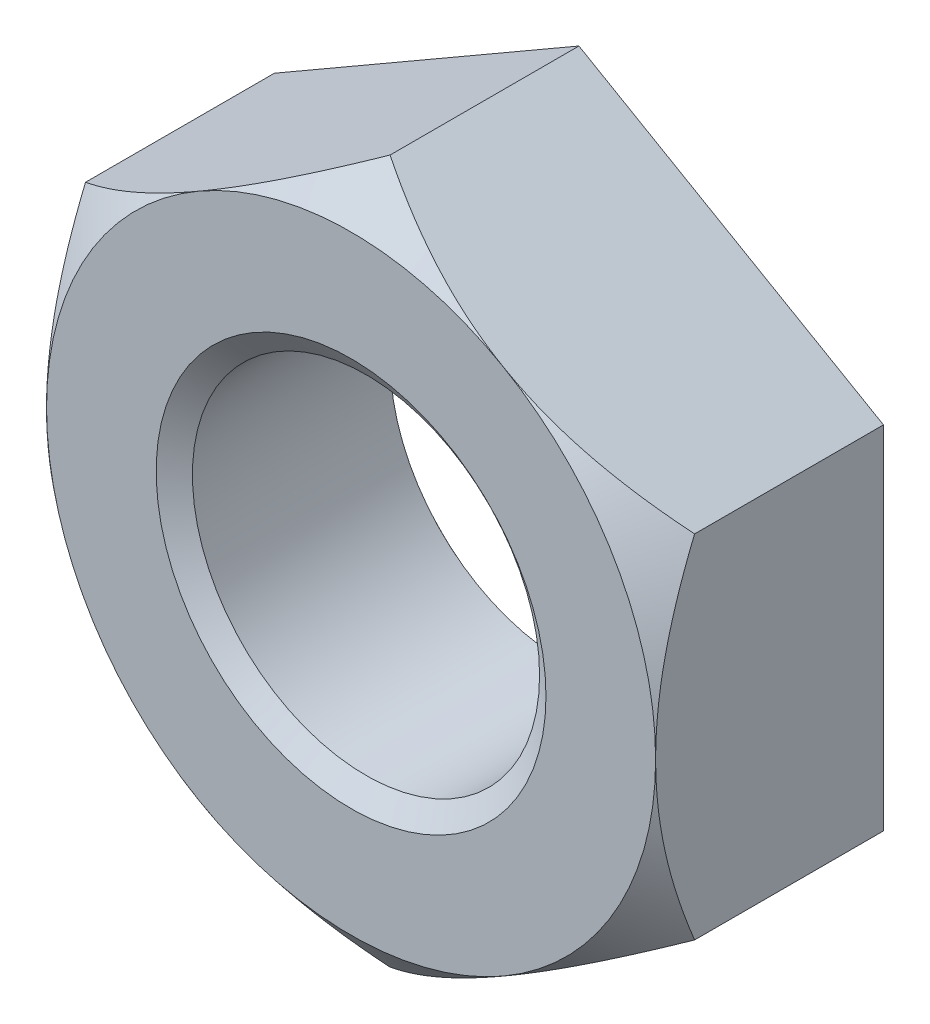
ISO-10303-21;
HEADER;
FILE_DESCRIPTION(('STEP AP214'),'2;1');
FILE_NAME('part.step','',(''),(''),'','','');
FILE_SCHEMA(('AUTOMOTIVE_DESIGN { 1 0 10303 214 1 1 1 1 }'));
ENDSEC;
DATA;
#1=APPLICATION_CONTEXT('core data for automotive mechanical design processes');
#2=APPLICATION_PROTOCOL_DEFINITION('international standard','automotive_design',2000,#1);
#3=PRODUCT_CONTEXT('',#1,'mechanical');
#4=PRODUCT('Part','Part','',(#3));
#5=PRODUCT_RELATED_PRODUCT_CATEGORY('part','',(#4));
#6=PRODUCT_DEFINITION_FORMATION('','',#4);
#7=PRODUCT_DEFINITION_CONTEXT('part definition',#1,'design');
#8=PRODUCT_DEFINITION('design','',#6,#7);
#9=PRODUCT_DEFINITION_SHAPE('','',#8);
#10=(LENGTH_UNIT() NAMED_UNIT(*) SI_UNIT(.MILLI.,.METRE.));
#11=(NAMED_UNIT(*) PLANE_ANGLE_UNIT() SI_UNIT($,.RADIAN.));
#12=(NAMED_UNIT(*) SI_UNIT($,.STERADIAN.) SOLID_ANGLE_UNIT());
#13=UNCERTAINTY_MEASURE_WITH_UNIT(LENGTH_MEASURE(1.E-05),#10,'distance_accuracy_value','');
#14=(GEOMETRIC_REPRESENTATION_CONTEXT(3) GLOBAL_UNCERTAINTY_ASSIGNED_CONTEXT((#13)) GLOBAL_UNIT_ASSIGNED_CONTEXT((#10,
#11,#12)) REPRESENTATION_CONTEXT('',''));
#15=CARTESIAN_POINT('',(0.,0.,0.));
#16=DIRECTION('',(0.,0.,1.));
#17=DIRECTION('',(1.,0.,0.));
#18=AXIS2_PLACEMENT_3D('',#15,#16,#17);
#19=CARTESIAN_POINT('',(0.,0.,-29.6926));
#20=DIRECTION('',(0.,0.,1.));
#21=DIRECTION('',(1.,0.,0.));
#22=AXIS2_PLACEMENT_3D('',#19,#20,#21);
#23=CYLINDRICAL_SURFACE('',#22,22.62124);
#24=CARTESIAN_POINT('',(0.,0.,-1.9457086988756));
#25=DIRECTION('',(0.,0.,1.));
#26=DIRECTION('',(1.,0.,0.));
#27=AXIS2_PLACEMENT_3D('',#24,#25,#26);
#28=CIRCLE('',#27,22.62124);
#29=CARTESIAN_POINT('',(22.62124,0.,-1.9457086988756));
#30=VERTEX_POINT('',#29);
#31=EDGE_CURVE('E130',#30,#30,#28,.F.);
#32=ORIENTED_EDGE('',*,*,#31,.F.);
#33=EDGE_LOOP('',(#32));
#34=FACE_BOUND('',#33,.T.);
#35=CARTESIAN_POINT('',(0.,0.,-27.7214913011244));
#36=DIRECTION('',(0.,0.,-1.));
#37=DIRECTION('',(-1.,0.,0.));
#38=AXIS2_PLACEMENT_3D('',#35,#36,#37);
#39=CIRCLE('',#38,22.62124);
#40=CARTESIAN_POINT('',(-22.62124,0.,-27.7214913011244));
#41=VERTEX_POINT('',#40);
#42=EDGE_CURVE('E37',#41,#41,#39,.F.);
#43=ORIENTED_EDGE('',*,*,#42,.F.);
#44=EDGE_LOOP('',(#43));
#45=FACE_BOUND('',#44,.T.);
#46=ADVANCED_FACE('F32',(#34,#45),#23,.F.);
#47=CARTESIAN_POINT('',(-79.3749999999999,0.,0.));
#48=DIRECTION('',(0.,0.,1.));
#49=DIRECTION('',(1.,0.,0.));
#50=AXIS2_PLACEMENT_3D('',#47,#48,#49);
#51=PLANE('',#50);
#52=CARTESIAN_POINT('',(0.,0.,0.));
#53=DIRECTION('',(0.,0.,1.));
#54=DIRECTION('',(1.,0.,0.));
#55=AXIS2_PLACEMENT_3D('',#52,#53,#54);
#56=CIRCLE('',#55,25.4);
#57=CARTESIAN_POINT('',(25.4,0.,0.));
#58=VERTEX_POINT('',#57);
#59=EDGE_CURVE('E217',#58,#58,#56,.T.);
#60=ORIENTED_EDGE('',*,*,#59,.F.);
#61=EDGE_LOOP('',(#60));
#62=FACE_BOUND('',#61,.T.);
#63=CARTESIAN_POINT('',(0.,0.,0.));
#64=DIRECTION('',(0.,0.,1.));
#65=DIRECTION('',(1.,0.,0.));
#66=AXIS2_PLACEMENT_3D('',#63,#64,#65);
#67=CIRCLE('',#66,39.6875);
#68=CARTESIAN_POINT('',(39.6875,0.,0.));
#69=VERTEX_POINT('',#68);
#70=CARTESIAN_POINT('',(19.84375,-34.3703832126949,0.));
#71=VERTEX_POINT('',#70);
#72=EDGE_CURVE('E11',#69,#71,#67,.F.);
#73=ORIENTED_EDGE('',*,*,#72,.F.);
#74=CARTESIAN_POINT('',(0.,0.,0.));
#75=DIRECTION('',(0.,0.,1.));
#76=DIRECTION('',(1.,0.,0.));
#77=AXIS2_PLACEMENT_3D('',#74,#75,#76);
#78=CIRCLE('',#77,39.6875);
#79=CARTESIAN_POINT('',(19.8437500000001,34.3703832126949,0.));
#80=VERTEX_POINT('',#79);
#81=EDGE_CURVE('E122',#69,#80,#78,.T.);
#82=ORIENTED_EDGE('',*,*,#81,.T.);
#83=CARTESIAN_POINT('',(-19.84375,34.3703832126949,0.));
#84=VERTEX_POINT('',#83);
#85=EDGE_CURVE('E44',#84,#80,#67,.F.);
#86=ORIENTED_EDGE('',*,*,#85,.F.);
#87=CARTESIAN_POINT('',(-39.6875,0.,0.));
#88=VERTEX_POINT('',#87);
#89=EDGE_CURVE('E271',#88,#84,#67,.F.);
#90=ORIENTED_EDGE('',*,*,#89,.F.);
#91=CARTESIAN_POINT('',(-19.84375,-34.3703832126949,0.));
#92=VERTEX_POINT('',#91);
#93=EDGE_CURVE('E273',#92,#88,#67,.F.);
#94=ORIENTED_EDGE('',*,*,#93,.F.);
#95=EDGE_CURVE('E42',#71,#92,#67,.F.);
#96=ORIENTED_EDGE('',*,*,#95,.F.);
#97=EDGE_LOOP('',(#73,#82,#86,#90,#94,#96));
#98=FACE_BOUND('',#97,.T.);
#99=ADVANCED_FACE('F132',(#62,#98),#51,.T.);
#100=CARTESIAN_POINT('',(0.,45.8271776169266,-29.6926));
#101=DIRECTION('',(-0.500000000000001,0.866025403784438,0.));
#102=DIRECTION('',(-0.866025403784438,-0.500000000000001,0.));
#103=AXIS2_PLACEMENT_3D('',#100,#101,#102);
#104=PLANE('',#103);
#105=CARTESIAN_POINT('',(0.000200000000008648,45.8272930869804,-5.08009554086177));
#106=CARTESIAN_POINT('',(-0.675362378218132,45.4372569660618,-4.75740980637057));
#107=CARTESIAN_POINT('',(-1.3547569213277,45.0450083437115,-4.44518483659009));
#108=CARTESIAN_POINT('',(-2.72161040098432,44.255855119289,-3.8444644403435));
#109=CARTESIAN_POINT('',(-3.40907190062726,43.8589490374126,-3.55597680269755));
#110=CARTESIAN_POINT('',(-4.79420473338667,43.0592422235556,-3.00488379402706));
#111=CARTESIAN_POINT('',(-5.49190147905994,42.6564268196284,-2.74236315877935));
#112=CARTESIAN_POINT('',(-6.89523688741963,41.8462107438486,-2.24748448913265));
#113=CARTESIAN_POINT('',(-7.60087484104338,41.4388104813735,-2.0151237846422));
#114=CARTESIAN_POINT('',(-9.01334120141884,40.6233226479894,-1.58581833885084));
#115=CARTESIAN_POINT('',(-9.72010005572324,40.2152752332046,-1.38856992044724));
#116=CARTESIAN_POINT('',(-11.1404844329942,39.3952159306345,-1.03010323704616));
#117=CARTESIAN_POINT('',(-11.8541100481971,38.9832039895965,-0.868885456729332));
#118=CARTESIAN_POINT('',(-13.2863448470649,38.1563028429274,-0.585602272074939));
#119=CARTESIAN_POINT('',(-14.0049472620728,37.7414175451823,-0.463491507583696));
#120=CARTESIAN_POINT('',(-15.446538218661,36.9091146183348,-0.260639689408306));
#121=CARTESIAN_POINT('',(-16.1695267221796,36.4916970112073,-0.179898277247445));
#122=CARTESIAN_POINT('',(-17.630331069793,35.6483012278793,-0.0605545378182199));
#123=CARTESIAN_POINT('',(-18.368192043889,35.2222969958605,-0.0226825232988908));
#124=CARTESIAN_POINT('',(-19.8446204307072,34.3698806692918,0.00757152347880483));
#125=CARTESIAN_POINT('',(-20.5831878468339,33.9434685727764,-4.66645945184485E-05));
#126=CARTESIAN_POINT('',(-22.059242806536,33.0912678444537,-0.0606042335508548));
#127=CARTESIAN_POINT('',(-22.7967297343713,32.6654795681441,-0.113563491625037));
#128=CARTESIAN_POINT('',(-24.2683079349113,31.8158634979287,-0.263592304194731));
#129=CARTESIAN_POINT('',(-25.0023992066788,31.3920357045641,-0.360661870865582));
#130=CARTESIAN_POINT('',(-26.465573084514,30.5472718723246,-0.596784274101464));
#131=CARTESIAN_POINT('',(-27.194654967739,30.1263362507834,-0.735843044678707));
#132=CARTESIAN_POINT('',(-28.6463836691976,29.288180294206,-1.05312836783003));
#133=CARTESIAN_POINT('',(-29.3690302955407,28.8709600699578,-1.23135608432558));
#134=CARTESIAN_POINT('',(-30.8067522929465,28.0408908877358,-1.62370548470428));
#135=CARTESIAN_POINT('',(-31.5218294409757,27.6280409038298,-1.83781853634994));
#136=CARTESIAN_POINT('',(-32.944072074641,26.8069087364301,-2.2985964240863));
#137=CARTESIAN_POINT('',(-33.6512373169414,26.3986266934264,-2.54526225838923));
#138=CARTESIAN_POINT('',(-34.8062681966621,25.7317693040973,-2.97446619349774));
#139=CARTESIAN_POINT('',(-35.2565422540784,25.471803455839,-3.14844506359477));
#140=CARTESIAN_POINT('',(-36.1535852489752,24.9538954412606,-3.50755980192611));
#141=CARTESIAN_POINT('',(-36.6003552410455,24.695952666073,-3.69269215538246));
#142=CARTESIAN_POINT('',(-37.4890449541568,24.1828674209821,-4.07269340288885));
#143=CARTESIAN_POINT('',(-37.9309759964886,23.9277184147286,-4.26752708270077));
#144=CARTESIAN_POINT('',(-38.811702131736,23.4192309434612,-4.66680287394708));
#145=CARTESIAN_POINT('',(-39.2504964008522,23.1658929540681,-4.87124740983446));
#146=CARTESIAN_POINT('',(-39.6877,22.9134733384094,-5.08009554086174));
#147=B_SPLINE_CURVE_WITH_KNOTS('',3,(#105,#106,#107,#108,#109,#110,#111,#112,#113,#114,#115,
#116,#117,#118,#119,#120,#121,#122,#123,#124,#125,#126,#127,#128,#129,#130,#131,#132,#133,#134,
#135,#136,#137,#138,#139,#140,#141,#142,#143,#144,#145,#146),.UNSPECIFIED.,.F.,.F.,(4,2,2,2,2,2,
2,2,2,2,2,2,2,2,2,2,2,2,2,2,4),(0.,2.53259620096936,5.06602012425204,7.60745580196207,
10.1486663299222,12.6667002043744,15.1847679491354,17.6999043239812,20.2150189041161,
22.7723642868658,25.329722056122,27.888201526601,30.4466817032726,33.0055236196886,
35.5644415834371,38.1227448791952,40.6811266420771,42.3258117324123,43.9699812198112,
45.608565036544,47.2475644472487),.UNSPECIFIED.);
#148=CARTESIAN_POINT('',(0.,45.8271776169266,-5.08));
#149=VERTEX_POINT('',#148);
#150=EDGE_CURVE('E182',#149,#84,#147,.T.);
#151=ORIENTED_EDGE('',*,*,#150,.F.);
#152=DIRECTION('',(0.,0.,1.));
#153=VECTOR('',#152,1.);
#154=CARTESIAN_POINT('',(0.,45.8271776169266,-29.6926));
#155=LINE('',#154,#153);
#156=CARTESIAN_POINT('',(0.,45.8271776169266,-29.6926));
#157=VERTEX_POINT('',#156);
#158=EDGE_CURVE('E241',#157,#149,#155,.T.);
#159=ORIENTED_EDGE('',*,*,#158,.F.);
#160=DIRECTION('',(-0.866025403784438,-0.500000000000001,0.));
#161=VECTOR('',#160,1.);
#162=CARTESIAN_POINT('',(0.,45.8271776169266,-29.6926));
#163=LINE('',#162,#161);
#164=CARTESIAN_POINT('',(-39.6875,22.9135888084633,-29.6926));
#165=VERTEX_POINT('',#164);
#166=EDGE_CURVE('E138',#157,#165,#163,.T.);
#167=ORIENTED_EDGE('',*,*,#166,.T.);
#168=DIRECTION('',(0.,0.,1.));
#169=VECTOR('',#168,1.);
#170=CARTESIAN_POINT('',(-39.6875,22.9135888084633,-29.6926));
#171=LINE('',#170,#169);
#172=CARTESIAN_POINT('',(-39.6875,22.9135888084633,-5.08));
#173=VERTEX_POINT('',#172);
#174=EDGE_CURVE('E228',#165,#173,#171,.T.);
#175=ORIENTED_EDGE('',*,*,#174,.T.);
#176=EDGE_CURVE('E177',#84,#173,#147,.T.);
#177=ORIENTED_EDGE('',*,*,#176,.F.);
#178=EDGE_LOOP('',(#151,#159,#167,#175,#177));
#179=FACE_BOUND('',#178,.T.);
#180=ADVANCED_FACE('F34',(#179),#104,.T.);
#181=CARTESIAN_POINT('',(39.6875,22.9135888084632,-29.6926));
#182=DIRECTION('',(0.500000000000001,0.866025403784438,0.));
#183=DIRECTION('',(-0.866025403784438,0.500000000000001,0.));
#184=AXIS2_PLACEMENT_3D('',#181,#182,#183);
#185=PLANE('',#184);
#186=CARTESIAN_POINT('',(39.6877,22.9134733384094,-5.08009554086173));
#187=CARTESIAN_POINT('',(39.0121376217819,23.303509459328,-4.75740980637053));
#188=CARTESIAN_POINT('',(38.3327430786723,23.6957580816783,-4.44518483659006));
#189=CARTESIAN_POINT('',(36.9658895990157,24.4849113061008,-3.84446444034347));
#190=CARTESIAN_POINT('',(36.2784280993727,24.8818173879772,-3.55597680269752));
#191=CARTESIAN_POINT('',(34.8932952666133,25.6815242018342,-3.00488379402703));
#192=CARTESIAN_POINT('',(34.1955985209401,26.0843396057614,-2.74236315877932));
#193=CARTESIAN_POINT('',(32.7922631125804,26.8945556815412,-2.24748448913262));
#194=CARTESIAN_POINT('',(32.0866251589566,27.3019559440163,-2.01512378464218));
#195=CARTESIAN_POINT('',(30.6741587985812,28.1174437774003,-1.58581833885082));
#196=CARTESIAN_POINT('',(29.9673999442768,28.5254911921851,-1.38856992044722));
#197=CARTESIAN_POINT('',(28.5470155670058,29.3455504947553,-1.03010323704614));
#198=CARTESIAN_POINT('',(27.8333899518029,29.7575624357933,-0.868885456729312));
#199=CARTESIAN_POINT('',(26.4011551529351,30.5844635824624,-0.585602272074926));
#200=CARTESIAN_POINT('',(25.6825527379272,30.9993488802075,-0.463491507583685));
#201=CARTESIAN_POINT('',(24.240961781339,31.831651807055,-0.260639689408294));
#202=CARTESIAN_POINT('',(23.5179732778204,32.2490694141825,-0.179898277247429));
#203=CARTESIAN_POINT('',(22.057168930207,33.0924651975105,-0.0605545378182037));
#204=CARTESIAN_POINT('',(21.3193079561111,33.5184694295293,-0.0226825232988784));
#205=CARTESIAN_POINT('',(19.8428795692928,34.370885756098,0.00757152347881256));
#206=CARTESIAN_POINT('',(19.1043121531661,34.7972978526134,-4.66645945114453E-05));
#207=CARTESIAN_POINT('',(17.628257193464,35.6494985809361,-0.0606042335508486));
#208=CARTESIAN_POINT('',(16.8907702656287,36.0752868572457,-0.11356349162503));
#209=CARTESIAN_POINT('',(15.4191920650887,36.924902927461,-0.263592304194725));
#210=CARTESIAN_POINT('',(14.6851007933213,37.3487307208257,-0.360661870865576));
#211=CARTESIAN_POINT('',(13.221926915486,38.1934945530651,-0.59678427410146));
#212=CARTESIAN_POINT('',(12.492845032261,38.6144301746064,-0.735843044678707));
#213=CARTESIAN_POINT('',(11.0411163308025,39.4525861311838,-1.05312836783003));
#214=CARTESIAN_POINT('',(10.3184697044593,39.869806355432,-1.23135608432558));
#215=CARTESIAN_POINT('',(8.88074770705355,40.699875537654,-1.62370548470428));
#216=CARTESIAN_POINT('',(8.16567055902437,41.11272552156,-1.83781853634993));
#217=CARTESIAN_POINT('',(6.74342792535908,41.9338576889596,-2.2985964240863));
#218=CARTESIAN_POINT('',(6.03626268305861,42.3421397319634,-2.54526225838923));
#219=CARTESIAN_POINT('',(4.8812318033379,43.0089971212925,-2.97446619349775));
#220=CARTESIAN_POINT('',(4.43095774592168,43.2689629695508,-3.14844506359478));
#221=CARTESIAN_POINT('',(3.53391475102487,43.7868709841292,-3.50755980192612));
#222=CARTESIAN_POINT('',(3.08714475895457,44.0448137593168,-3.69269215538248));
#223=CARTESIAN_POINT('',(2.19845504584327,44.5578990044077,-4.07269340288887));
#224=CARTESIAN_POINT('',(1.75652400351137,44.8130480106612,-4.26752708270078));
#225=CARTESIAN_POINT('',(0.875797868263965,45.3215354819287,-4.6668028739471));
#226=CARTESIAN_POINT('',(0.437003599147832,45.5748734713217,-4.87124740983448));
#227=CARTESIAN_POINT('',(-0.000199999999992159,45.8272930869804,-5.08009554086177));
#228=B_SPLINE_CURVE_WITH_KNOTS('',3,(#186,#187,#188,#189,#190,#191,#192,#193,#194,#195,#196,
#197,#198,#199,#200,#201,#202,#203,#204,#205,#206,#207,#208,#209,#210,#211,#212,#213,#214,#215,
#216,#217,#218,#219,#220,#221,#222,#223,#224,#225,#226,#227),.UNSPECIFIED.,.F.,.F.,(4,2,2,2,2,2,
2,2,2,2,2,2,2,2,2,2,2,2,2,2,4),(0.,2.53259620096935,5.06602012425204,7.60745580196207,
10.1486663299222,12.6667002043744,15.1847679491354,17.6999043239812,20.2150189041161,
22.7723642868658,25.329722056122,27.888201526601,30.4466817032726,33.0055236196886,
35.5644415834371,38.1227448791951,40.681126642077,42.3258117324123,43.9699812198112,
45.608565036544,47.2475644472487),.UNSPECIFIED.);
#229=CARTESIAN_POINT('',(39.6875,22.9135888084633,-5.08));
#230=VERTEX_POINT('',#229);
#231=EDGE_CURVE('E125',#230,#80,#228,.T.);
#232=ORIENTED_EDGE('',*,*,#231,.F.);
#233=DIRECTION('',(0.,0.,1.));
#234=VECTOR('',#233,1.);
#235=CARTESIAN_POINT('',(39.6875,22.9135888084632,-29.6926));
#236=LINE('',#235,#234);
#237=CARTESIAN_POINT('',(39.6875,22.9135888084632,-29.6926));
#238=VERTEX_POINT('',#237);
#239=EDGE_CURVE('E137',#238,#230,#236,.T.);
#240=ORIENTED_EDGE('',*,*,#239,.F.);
#241=DIRECTION('',(-0.866025403784438,0.500000000000001,0.));
#242=VECTOR('',#241,1.);
#243=CARTESIAN_POINT('',(39.6875,22.9135888084632,-29.6926));
#244=LINE('',#243,#242);
#245=EDGE_CURVE('E232',#238,#157,#244,.T.);
#246=ORIENTED_EDGE('',*,*,#245,.T.);
#247=ORIENTED_EDGE('',*,*,#158,.T.);
#248=EDGE_CURVE('E148',#80,#149,#228,.T.);
#249=ORIENTED_EDGE('',*,*,#248,.F.);
#250=EDGE_LOOP('',(#232,#240,#246,#247,#249));
#251=FACE_BOUND('',#250,.T.);
#252=ADVANCED_FACE('F163',(#251),#185,.T.);
#253=CARTESIAN_POINT('',(39.6875,22.9135888084632,-29.6926));
#254=DIRECTION('',(-1.,0.,0.));
#255=DIRECTION('',(0.,-1.,0.));
#256=AXIS2_PLACEMENT_3D('',#253,#254,#255);
#257=PLANE('',#256);
#258=ORIENTED_EDGE('',*,*,#239,.T.);
#259=CARTESIAN_POINT('',(39.6875,-51.6328225617732,-21.0457198261144));
#260=CARTESIAN_POINT('',(39.6875,-50.9711763672413,-20.6116874485865));
#261=CARTESIAN_POINT('',(39.6875,-50.3081162489392,-20.1798041243193));
#262=CARTESIAN_POINT('',(39.6875,-48.9789178290214,-19.3207795147177));
#263=CARTESIAN_POINT('',(39.6875,-48.3127794809869,-18.8936383012255));
#264=CARTESIAN_POINT('',(39.6875,-46.9770520322295,-18.0444645788605));
#265=CARTESIAN_POINT('',(39.6875,-46.3074622267201,-17.6224331775177));
#266=CARTESIAN_POINT('',(39.6875,-44.9647085157808,-16.7841033357561));
#267=CARTESIAN_POINT('',(39.6875,-44.2915446227527,-16.3678048754624));
#268=CARTESIAN_POINT('',(39.6875,-42.2568910350694,-15.1226295216118));
#269=CARTESIAN_POINT('',(39.6875,-40.8894876977901,-14.303373472346));
#270=CARTESIAN_POINT('',(39.6875,-38.1364157157677,-12.6961963985621));
#271=CARTESIAN_POINT('',(39.6875,-36.7507482016962,-11.9082734463391));
#272=CARTESIAN_POINT('',(39.6875,-34.6202465175937,-10.7357414695621));
#273=CARTESIAN_POINT('',(39.6875,-33.883142153706,-10.3370700215875));
#274=CARTESIAN_POINT('',(39.6875,-32.4025093553702,-9.5518101034775));
#275=CARTESIAN_POINT('',(39.6875,-31.6589809026361,-9.1652216677508));
#276=CARTESIAN_POINT('',(39.6875,-30.1648802706844,-8.40558030869589));
#277=CARTESIAN_POINT('',(39.6875,-29.4143069750479,-8.03252957792258));
#278=CARTESIAN_POINT('',(39.6875,-27.9057210128597,-7.30176643813181));
#279=CARTESIAN_POINT('',(39.6875,-27.1477083873151,-6.94405394462548));
#280=CARTESIAN_POINT('',(39.6875,-25.6257322693701,-6.24685408494801));
#281=CARTESIAN_POINT('',(39.6875,-24.8617895693373,-5.9073214280591));
#282=CARTESIAN_POINT('',(39.6875,-23.3255198091508,-5.24768587063815));
#283=CARTESIAN_POINT('',(39.6875,-22.5531925628723,-4.92758340247225));
#284=CARTESIAN_POINT('',(39.6875,-21.0000557177916,-4.30940863178999));
#285=CARTESIAN_POINT('',(39.6875,-20.2192491500448,-4.01132873620555));
#286=CARTESIAN_POINT('',(39.6875,-18.6486688993825,-3.43983380916539));
#287=CARTESIAN_POINT('',(39.6875,-17.8588956110767,-3.16641769700037));
#288=CARTESIAN_POINT('',(39.6875,-16.2782209721058,-2.64980510868287));
#289=CARTESIAN_POINT('',(39.6875,-15.4874096982703,-2.40633404284441));
#290=CARTESIAN_POINT('',(39.6875,-13.8971196730041,-1.949521193496));
#291=CARTESIAN_POINT('',(39.6875,-13.0976411780003,-1.73617852121719));
#292=CARTESIAN_POINT('',(39.6875,-11.490505656062,-1.34270689884543));
#293=CARTESIAN_POINT('',(39.6875,-10.6828485577701,-1.16257823880472));
#294=CARTESIAN_POINT('',(39.6875,-9.06026613990107,-0.838523837576269));
#295=CARTESIAN_POINT('',(39.6875,-8.24534084565409,-0.694597970270693));
#296=CARTESIAN_POINT('',(39.6875,-6.62443803963803,-0.44789053679595));
#297=CARTESIAN_POINT('',(39.6875,-5.81856783479586,-0.344407435972398));
#298=CARTESIAN_POINT('',(39.6875,-4.20271348464461,-0.176943966081104));
#299=CARTESIAN_POINT('',(39.6875,-3.39272937158293,-0.112963287848917));
#300=CARTESIAN_POINT('',(39.6875,-1.77060014097972,-0.0258418024225941));
#301=CARTESIAN_POINT('',(39.6875,-0.958455144349754,-0.00269875637746664));
#302=CARTESIAN_POINT('',(39.6875,0.665955806422227,0.00225284073911517));
#303=CARTESIAN_POINT('',(39.6875,1.47822175873214,-0.0159380354063192));
#304=CARTESIAN_POINT('',(39.6875,3.04262978620853,-0.0904816967942533));
#305=CARTESIAN_POINT('',(39.6875,3.79490888298955,-0.144006137982676));
#306=CARTESIAN_POINT('',(39.6875,5.29621422506813,-0.285354448282872));
#307=CARTESIAN_POINT('',(39.6875,6.04524051937348,-0.373177798810451));
#308=CARTESIAN_POINT('',(39.6875,7.53870946417253,-0.581619226597829));
#309=CARTESIAN_POINT('',(39.6875,8.28315200884954,-0.70223805806608));
#310=CARTESIAN_POINT('',(39.6875,9.76635407238924,-0.974351273005124));
#311=CARTESIAN_POINT('',(39.6875,10.5051135293359,-1.125845992369));
#312=CARTESIAN_POINT('',(39.6875,11.9915712027742,-1.4610042876546));
#313=CARTESIAN_POINT('',(39.6875,12.739131747527,-1.64527612429139));
#314=CARTESIAN_POINT('',(39.6875,14.22692970878,-2.04125829546036));
#315=CARTESIAN_POINT('',(39.6875,14.9671670312339,-2.25296898187678));
#316=CARTESIAN_POINT('',(39.6875,16.4398374833948,-2.70128400744475));
#317=CARTESIAN_POINT('',(39.6875,17.1722725001704,-2.93788216950768));
#318=CARTESIAN_POINT('',(39.6875,18.6294175284696,-3.43359252913646));
#319=CARTESIAN_POINT('',(39.6875,19.3541279258292,-3.6927035962362));
#320=CARTESIAN_POINT('',(39.6875,20.8232310833092,-4.24136165425784));
#321=CARTESIAN_POINT('',(39.6875,21.5673316646934,-4.53168910379808));
#322=CARTESIAN_POINT('',(39.6875,23.0476598759365,-5.13183376214373));
#323=CARTESIAN_POINT('',(39.6875,23.7838870428162,-5.44165210977677));
#324=CARTESIAN_POINT('',(39.6875,25.2489982758851,-6.07874085809014));
#325=CARTESIAN_POINT('',(39.6875,25.9778800616277,-6.4060164914637));
#326=CARTESIAN_POINT('',(39.6875,27.4284730415926,-7.07603037663764));
#327=CARTESIAN_POINT('',(39.6875,28.150184352275,-7.41876837680201));
#328=CARTESIAN_POINT('',(39.6875,29.5878108526177,-8.11847594604665));
#329=CARTESIAN_POINT('',(39.6875,30.3037174013003,-8.47546323894451));
#330=CARTESIAN_POINT('',(39.6875,31.7292596203181,-9.20177066567085));
#331=CARTESIAN_POINT('',(39.6875,32.4388951343641,-9.57109110578087));
#332=CARTESIAN_POINT('',(39.6875,33.8522184642118,-10.3206859178583));
#333=CARTESIAN_POINT('',(39.6875,34.5559071276958,-10.7009586933822));
#334=CARTESIAN_POINT('',(39.6875,35.9578716156223,-11.4713640904577));
#335=CARTESIAN_POINT('',(39.6875,36.6561473515262,-11.8614968728458));
#336=CARTESIAN_POINT('',(39.6875,38.7525009714226,-13.0502493271726));
#337=CARTESIAN_POINT('',(39.6875,40.1429535242398,-13.8623368759573));
#338=CARTESIAN_POINT('',(39.6875,42.9065478219297,-15.5153833509438));
#339=CARTESIAN_POINT('',(39.6875,44.2796891774659,-16.3563429249119));
#340=CARTESIAN_POINT('',(39.6875,47.0102618878544,-18.0612949767672));
#341=CARTESIAN_POINT('',(39.6875,48.3677033687017,-18.9252712668503));
#342=CARTESIAN_POINT('',(39.6875,51.0699566698335,-20.6726859018107));
#343=CARTESIAN_POINT('',(39.6875,52.4147686196264,-21.5561240468069));
#344=CARTESIAN_POINT('',(39.6875,54.9416289010451,-23.2381057356394));
#345=CARTESIAN_POINT('',(39.6875,56.124835891438,-24.0349116057157));
#346=CARTESIAN_POINT('',(39.6875,58.4837915512901,-25.6394756549528));
#347=CARTESIAN_POINT('',(39.6875,59.6595402325006,-26.447233816851));
#348=CARTESIAN_POINT('',(39.6875,62.004680365178,-28.0723416749042));
#349=CARTESIAN_POINT('',(39.6875,63.1740707022467,-28.8896929778486));
#350=CARTESIAN_POINT('',(39.6875,65.5070659307336,-30.5326124668601));
#351=CARTESIAN_POINT('',(39.6875,66.6706708066629,-31.358180674908));
#352=CARTESIAN_POINT('',(39.6875,68.9768909376784,-33.0051660939369));
#353=CARTESIAN_POINT('',(39.6875,70.1195757715592,-33.8264859330917));
#354=CARTESIAN_POINT('',(39.6875,72.4005033043231,-35.475271874458));
#355=CARTESIAN_POINT('',(39.6875,73.5387459965324,-36.3027379858981));
#356=CARTESIAN_POINT('',(39.6875,75.8109571954491,-37.9628759019715));
#357=CARTESIAN_POINT('',(39.6875,76.9449267693809,-38.795546246655));
#358=CARTESIAN_POINT('',(39.6875,79.2092896185033,-40.4657187843561));
#359=CARTESIAN_POINT('',(39.6875,80.3396829202291,-41.3032209413921));
#360=CARTESIAN_POINT('',(39.6875,81.468491590366,-42.1428481011268));
#361=B_SPLINE_CURVE_WITH_KNOTS('',3,(#259,#260,#261,#262,#263,#264,#265,#266,#267,#268,#269,
#270,#271,#272,#273,#274,#275,#276,#277,#278,#279,#280,#281,#282,#283,#284,#285,#286,#287,#288,
#289,#290,#291,#292,#293,#294,#295,#296,#297,#298,#299,#300,#301,#302,#303,#304,#305,#306,#307,
#308,#309,#310,#311,#312,#313,#314,#315,#316,#317,#318,#319,#320,#321,#322,#323,#324,#325,#326,
#327,#328,#329,#330,#331,#332,#333,#334,#335,#336,#337,#338,#339,#340,#341,#342,#343,#344,#345,
#346,#347,#348,#349,#350,#351,#352,#353,#354,#355,#356,#357,#358,#359,#360),.UNSPECIFIED.,.F.,
.F.,(4,2,2,2,2,2,2,2,2,2,2,2,2,2,2,2,2,2,2,2,2,2,2,2,2,2,2,2,2,2,2,2,2,2,2,2,2,2,2,2,2,2,2,2,2,
2,2,2,2,2,4),(0.,2.37390854149781,4.74785299838772,7.12230310410022,9.49674497607132,
14.2785351295475,19.060030636564,21.5739708021067,24.0879181259218,26.6022708056346,
29.1166096335522,31.6243614525894,34.1321690543991,36.6391079253516,39.1459368946939,
41.6277244169124,44.1094387126428,46.59117467973,49.0729020011997,51.5094354548976,
53.9459498389027,56.3823306411635,58.8186776815843,61.0804212327495,63.3421305886858,
65.6038919622954,67.8656779425026,70.1749197046787,72.4841910842122,74.7928906474037,
77.101474348163,79.4973670049812,81.8933997809175,84.2901548306221,86.6868708893724,
89.0866671212436,91.4865229940724,93.8860308100302,96.2855777920507,101.11578528758,
105.946101223472,110.773105264199,115.600059752747,119.87946643631,124.158866375553,
128.438993616511,132.719132310206,136.940798018509,141.162470066988,145.383006678417,
149.603511900633),.UNSPECIFIED.);
#362=EDGE_CURVE('E117',#230,#69,#361,.F.);
#363=ORIENTED_EDGE('',*,*,#362,.T.);
#364=CARTESIAN_POINT('',(39.6875,-22.9135888084634,-5.08));
#365=VERTEX_POINT('',#364);
#366=EDGE_CURVE('E106',#69,#365,#361,.F.);
#367=ORIENTED_EDGE('',*,*,#366,.T.);
#368=DIRECTION('',(0.,0.,1.));
#369=VECTOR('',#368,1.);
#370=CARTESIAN_POINT('',(39.6875,-22.9135888084634,-29.6926));
#371=LINE('',#370,#369);
#372=CARTESIAN_POINT('',(39.6875,-22.9135888084634,-29.6926));
#373=VERTEX_POINT('',#372);
#374=EDGE_CURVE('E238',#373,#365,#371,.T.);
#375=ORIENTED_EDGE('',*,*,#374,.F.);
#376=DIRECTION('',(0.,-1.,0.));
#377=VECTOR('',#376,1.);
#378=CARTESIAN_POINT('',(39.6875,22.9135888084632,-29.6926));
#379=LINE('',#378,#377);
#380=EDGE_CURVE('E246',#238,#373,#379,.T.);
#381=ORIENTED_EDGE('',*,*,#380,.F.);
#382=EDGE_LOOP('',(#258,#363,#367,#375,#381));
#383=FACE_BOUND('',#382,.T.);
#384=ADVANCED_FACE('F135',(#383),#257,.F.);
#385=CARTESIAN_POINT('',(0.,-45.8271776169267,-29.6926));
#386=DIRECTION('',(0.500000000000001,-0.866025403784438,0.));
#387=DIRECTION('',(0.866025403784438,0.500000000000001,0.));
#388=AXIS2_PLACEMENT_3D('',#385,#386,#387);
#389=PLANE('',#388);
#390=CARTESIAN_POINT('',(-0.000200000000006572,-45.8272930869805,-5.08009554086186));
#391=CARTESIAN_POINT('',(0.675362378218135,-45.4372569660619,-4.75740980637066));
#392=CARTESIAN_POINT('',(1.3547569213277,-45.0450083437116,-4.44518483659018));
#393=CARTESIAN_POINT('',(2.72161040098433,-44.2558551192891,-3.84446444034359));
#394=CARTESIAN_POINT('',(3.40907190062727,-43.8589490374127,-3.55597680269764));
#395=CARTESIAN_POINT('',(4.79420473338669,-43.0592422235557,-3.00488379402714));
#396=CARTESIAN_POINT('',(5.49190147905996,-42.6564268196285,-2.74236315877943));
#397=CARTESIAN_POINT('',(6.89523688741966,-41.8462107438487,-2.24748448913273));
#398=CARTESIAN_POINT('',(7.60087484104341,-41.4388104813736,-2.01512378464228));
#399=CARTESIAN_POINT('',(9.01334120141887,-40.6233226479895,-1.58581833885093));
#400=CARTESIAN_POINT('',(9.72010005572327,-40.2152752332047,-1.38856992044732));
#401=CARTESIAN_POINT('',(11.1404844329942,-39.3952159306346,-1.03010323704624));
#402=CARTESIAN_POINT('',(11.8541100481972,-38.9832039895966,-0.868885456729411));
#403=CARTESIAN_POINT('',(13.2863448470649,-38.1563028429275,-0.585602272075018));
#404=CARTESIAN_POINT('',(14.0049472620729,-37.7414175451824,-0.463491507583776));
#405=CARTESIAN_POINT('',(15.446538218661,-36.9091146183349,-0.260639689408386));
#406=CARTESIAN_POINT('',(16.1695267221796,-36.4916970112074,-0.179898277247523));
#407=CARTESIAN_POINT('',(17.6303310697931,-35.6483012278794,-0.0605545378182957));
#408=CARTESIAN_POINT('',(18.368192043889,-35.2222969958606,-0.0226825232989671));
#409=CARTESIAN_POINT('',(19.8446204307073,-34.3698806692919,0.00757152347872535));
#410=CARTESIAN_POINT('',(20.583187846834,-33.9434685727764,-4.66645946004108E-05));
#411=CARTESIAN_POINT('',(22.059242806536,-33.0912678444537,-0.0606042335509352));
#412=CARTESIAN_POINT('',(22.7967297343714,-32.6654795681442,-0.113563491625113));
#413=CARTESIAN_POINT('',(24.2683079349114,-31.8158634979288,-0.26359230419481));
#414=CARTESIAN_POINT('',(25.0023992066788,-31.3920357045641,-0.360661870865667));
#415=CARTESIAN_POINT('',(26.4655730845141,-30.5472718723247,-0.596784274101549));
#416=CARTESIAN_POINT('',(27.1946549677391,-30.1263362507835,-0.735843044678786));
#417=CARTESIAN_POINT('',(28.6463836691977,-29.2881802942061,-1.0531283678301));
#418=CARTESIAN_POINT('',(29.3690302955408,-28.8709600699579,-1.23135608432566));
#419=CARTESIAN_POINT('',(30.8067522929466,-28.0408908877358,-1.62370548470437));
#420=CARTESIAN_POINT('',(31.5218294409758,-27.6280409038298,-1.83781853635003));
#421=CARTESIAN_POINT('',(32.9440720746411,-26.8069087364302,-2.2985964240864));
#422=CARTESIAN_POINT('',(33.6512373169415,-26.3986266934265,-2.54526225838932));
#423=CARTESIAN_POINT('',(34.8062681966622,-25.7317693040974,-2.97446619349783));
#424=CARTESIAN_POINT('',(35.2565422540784,-25.471803455839,-3.14844506359486));
#425=CARTESIAN_POINT('',(36.1535852489752,-24.9538954412607,-3.50755980192619));
#426=CARTESIAN_POINT('',(36.6003552410455,-24.6959526660731,-3.69269215538254));
#427=CARTESIAN_POINT('',(37.4890449541568,-24.1828674209822,-4.07269340288892));
#428=CARTESIAN_POINT('',(37.9309759964887,-23.9277184147287,-4.26752708270083));
#429=CARTESIAN_POINT('',(38.8117021317361,-23.4192309434612,-4.66680287394714));
#430=CARTESIAN_POINT('',(39.2504964008522,-23.1658929540682,-4.87124740983451));
#431=CARTESIAN_POINT('',(39.6877,-22.9134733384095,-5.08009554086179));
#432=B_SPLINE_CURVE_WITH_KNOTS('',3,(#390,#391,#392,#393,#394,#395,#396,#397,#398,#399,#400,
#401,#402,#403,#404,#405,#406,#407,#408,#409,#410,#411,#412,#413,#414,#415,#416,#417,#418,#419,
#420,#421,#422,#423,#424,#425,#426,#427,#428,#429,#430,#431),.UNSPECIFIED.,.F.,.F.,(4,2,2,2,2,2,
2,2,2,2,2,2,2,2,2,2,2,2,2,2,4),(0.,2.53259620096937,5.06602012425206,7.6074558019621,
10.1486663299222,12.6667002043745,15.1847679491355,17.6999043239812,20.2150189041161,
22.7723642868659,25.3297220561221,27.8882015266011,30.4466817032727,33.0055236196887,
35.5644415834372,38.1227448791953,40.6811266420772,42.3258117324124,43.9699812198113,
45.6085650365441,47.2475644472487),.UNSPECIFIED.);
#433=CARTESIAN_POINT('',(-1.97758476261356E-13,-45.8271776169266,-5.08));
#434=VERTEX_POINT('',#433);
#435=EDGE_CURVE('E51',#434,#71,#432,.T.);
#436=ORIENTED_EDGE('',*,*,#435,.F.);
#437=DIRECTION('',(0.,0.,1.));
#438=VECTOR('',#437,1.);
#439=CARTESIAN_POINT('',(0.,-45.8271776169267,-29.6926));
#440=LINE('',#439,#438);
#441=CARTESIAN_POINT('',(0.,-45.8271776169267,-29.6926));
#442=VERTEX_POINT('',#441);
#443=EDGE_CURVE('E235',#442,#434,#440,.T.);
#444=ORIENTED_EDGE('',*,*,#443,.F.);
#445=DIRECTION('',(0.866025403784438,0.500000000000001,0.));
#446=VECTOR('',#445,1.);
#447=CARTESIAN_POINT('',(0.,-45.8271776169267,-29.6926));
#448=LINE('',#447,#446);
#449=EDGE_CURVE('E248',#442,#373,#448,.T.);
#450=ORIENTED_EDGE('',*,*,#449,.T.);
#451=ORIENTED_EDGE('',*,*,#374,.T.);
#452=EDGE_CURVE('E112',#71,#365,#432,.T.);
#453=ORIENTED_EDGE('',*,*,#452,.F.);
#454=EDGE_LOOP('',(#436,#444,#450,#451,#453));
#455=FACE_BOUND('',#454,.T.);
#456=ADVANCED_FACE('F162',(#455),#389,.T.);
#457=CARTESIAN_POINT('',(-39.6875,-22.9135888084633,-29.6926));
#458=DIRECTION('',(-0.500000000000001,-0.866025403784438,0.));
#459=DIRECTION('',(0.866025403784438,-0.500000000000001,0.));
#460=AXIS2_PLACEMENT_3D('',#457,#458,#459);
#461=PLANE('',#460);
#462=CARTESIAN_POINT('',(-39.6877,-22.9134733384095,-5.08009554086177));
#463=CARTESIAN_POINT('',(-39.0121376217819,-23.3035094593281,-4.75740980637058));
#464=CARTESIAN_POINT('',(-38.3327430786723,-23.6957580816784,-4.4451848365901));
#465=CARTESIAN_POINT('',(-36.9658895990157,-24.4849113061009,-3.84446444034351));
#466=CARTESIAN_POINT('',(-36.2784280993727,-24.8818173879773,-3.55597680269756));
#467=CARTESIAN_POINT('',(-34.8932952666133,-25.6815242018343,-3.00488379402707));
#468=CARTESIAN_POINT('',(-34.19559852094,-26.0843396057615,-2.74236315877937));
#469=CARTESIAN_POINT('',(-32.7922631125804,-26.8945556815413,-2.24748448913268));
#470=CARTESIAN_POINT('',(-32.0866251589566,-27.3019559440164,-2.01512378464223));
#471=CARTESIAN_POINT('',(-30.6741587985811,-28.1174437774005,-1.58581833885088));
#472=CARTESIAN_POINT('',(-29.9673999442767,-28.5254911921853,-1.38856992044728));
#473=CARTESIAN_POINT('',(-28.5470155670058,-29.3455504947554,-1.0301032370462));
#474=CARTESIAN_POINT('',(-27.8333899518029,-29.7575624357934,-0.86888545672937));
#475=CARTESIAN_POINT('',(-26.4011551529351,-30.5844635824625,-0.585602272074985));
#476=CARTESIAN_POINT('',(-25.6825527379272,-30.9993488802076,-0.463491507583748));
#477=CARTESIAN_POINT('',(-24.240961781339,-31.8316518070551,-0.26063968940836));
#478=CARTESIAN_POINT('',(-23.5179732778204,-32.2490694141826,-0.179898277247496));
#479=CARTESIAN_POINT('',(-22.057168930207,-33.0924651975106,-0.0605545378182728));
#480=CARTESIAN_POINT('',(-21.319307956111,-33.5184694295294,-0.0226825232989496));
#481=CARTESIAN_POINT('',(-19.8428795692928,-34.3708857560981,0.00757152347873625));
#482=CARTESIAN_POINT('',(-19.1043121531661,-34.7972978526135,-4.6664594590775E-05));
#483=CARTESIAN_POINT('',(-17.628257193464,-35.6494985809362,-0.0606042335509291));
#484=CARTESIAN_POINT('',(-16.8907702656287,-36.0752868572458,-0.113563491625109));
#485=CARTESIAN_POINT('',(-15.4191920650887,-36.9249029274612,-0.263592304194806));
#486=CARTESIAN_POINT('',(-14.6851007933213,-37.3487307208258,-0.360661870865661));
#487=CARTESIAN_POINT('',(-13.221926915486,-38.1934945530653,-0.596784274101547));
#488=CARTESIAN_POINT('',(-12.492845032261,-38.6144301746065,-0.735843044678791));
#489=CARTESIAN_POINT('',(-11.0411163308024,-39.4525861311839,-1.05312836783011));
#490=CARTESIAN_POINT('',(-10.3184697044593,-39.8698063554321,-1.23135608432567));
#491=CARTESIAN_POINT('',(-8.88074770705354,-40.6998755376541,-1.62370548470437));
#492=CARTESIAN_POINT('',(-8.16567055902436,-41.1127255215601,-1.83781853635003));
#493=CARTESIAN_POINT('',(-6.74342792535907,-41.9338576889598,-2.2985964240864));
#494=CARTESIAN_POINT('',(-6.03626268305859,-42.3421397319635,-2.54526225838933));
#495=CARTESIAN_POINT('',(-4.88123180333789,-43.0089971212926,-2.97446619349784));
#496=CARTESIAN_POINT('',(-4.43095774592166,-43.2689629695509,-3.14844506359487));
#497=CARTESIAN_POINT('',(-3.53391475102485,-43.7868709841293,-3.50755980192621));
#498=CARTESIAN_POINT('',(-3.08714475895456,-44.0448137593169,-3.69269215538257));
#499=CARTESIAN_POINT('',(-2.19845504584326,-44.5578990044078,-4.07269340288896));
#500=CARTESIAN_POINT('',(-1.75652400351137,-44.8130480106613,-4.26752708270087));
#501=CARTESIAN_POINT('',(-0.875797868263967,-45.3215354819288,-4.66680287394719));
#502=CARTESIAN_POINT('',(-0.437003599147833,-45.5748734713218,-4.87124740983456));
#503=CARTESIAN_POINT('',(0.000199999999992186,-45.8272930869805,-5.08009554086185));
#504=B_SPLINE_CURVE_WITH_KNOTS('',3,(#462,#463,#464,#465,#466,#467,#468,#469,#470,#471,#472,
#473,#474,#475,#476,#477,#478,#479,#480,#481,#482,#483,#484,#485,#486,#487,#488,#489,#490,#491,
#492,#493,#494,#495,#496,#497,#498,#499,#500,#501,#502,#503),.UNSPECIFIED.,.F.,.F.,(4,2,2,2,2,2,
2,2,2,2,2,2,2,2,2,2,2,2,2,2,4),(0.,2.53259620096936,5.06602012425204,7.60745580196208,
10.1486663299222,12.6667002043744,15.1847679491354,17.6999043239812,20.2150189041161,
22.7723642868658,25.329722056122,27.888201526601,30.4466817032726,33.0055236196886,
35.5644415834371,38.1227448791951,40.6811266420771,42.3258117324123,43.9699812198112,
45.608565036544,47.2475644472487),.UNSPECIFIED.);
#505=CARTESIAN_POINT('',(-39.6875,-22.9135888084633,-5.08));
#506=VERTEX_POINT('',#505);
#507=EDGE_CURVE('E58',#506,#92,#504,.T.);
#508=ORIENTED_EDGE('',*,*,#507,.F.);
#509=DIRECTION('',(0.,0.,1.));
#510=VECTOR('',#509,1.);
#511=CARTESIAN_POINT('',(-39.6875,-22.9135888084633,-29.6926));
#512=LINE('',#511,#510);
#513=CARTESIAN_POINT('',(-39.6875,-22.9135888084633,-29.6926));
#514=VERTEX_POINT('',#513);
#515=EDGE_CURVE('E231',#514,#506,#512,.T.);
#516=ORIENTED_EDGE('',*,*,#515,.F.);
#517=DIRECTION('',(0.866025403784438,-0.500000000000001,0.));
#518=VECTOR('',#517,1.);
#519=CARTESIAN_POINT('',(-39.6875,-22.9135888084633,-29.6926));
#520=LINE('',#519,#518);
#521=EDGE_CURVE('E251',#514,#442,#520,.T.);
#522=ORIENTED_EDGE('',*,*,#521,.T.);
#523=ORIENTED_EDGE('',*,*,#443,.T.);
#524=EDGE_CURVE('E176',#92,#434,#504,.T.);
#525=ORIENTED_EDGE('',*,*,#524,.F.);
#526=EDGE_LOOP('',(#508,#516,#522,#523,#525));
#527=FACE_BOUND('',#526,.T.);
#528=ADVANCED_FACE('F169',(#527),#461,.T.);
#529=CARTESIAN_POINT('',(-39.6875,22.9135888084633,-29.6926));
#530=DIRECTION('',(-1.,0.,0.));
#531=DIRECTION('',(0.,0.,1.));
#532=AXIS2_PLACEMENT_3D('',#529,#530,#531);
#533=PLANE('',#532);
#534=CARTESIAN_POINT('',(-39.6875,-51.6328225617731,-21.0457198261144));
#535=CARTESIAN_POINT('',(-39.6875,-50.9711763672412,-20.6116874485865));
#536=CARTESIAN_POINT('',(-39.6875,-50.3081162489391,-20.1798041243193));
#537=CARTESIAN_POINT('',(-39.6875,-48.9789178290213,-19.3207795147176));
#538=CARTESIAN_POINT('',(-39.6875,-48.3127794809868,-18.8936383012254));
#539=CARTESIAN_POINT('',(-39.6875,-46.9770520322294,-18.0444645788604));
#540=CARTESIAN_POINT('',(-39.6875,-46.30746222672,-17.6224331775177));
#541=CARTESIAN_POINT('',(-39.6875,-44.9647085157807,-16.7841033357561));
#542=CARTESIAN_POINT('',(-39.6875,-44.2915446227526,-16.3678048754624));
#543=CARTESIAN_POINT('',(-39.6875,-42.2568910350693,-15.1226295216117));
#544=CARTESIAN_POINT('',(-39.6875,-40.88948769779,-14.303373472346));
#545=CARTESIAN_POINT('',(-39.6875,-38.1364157157676,-12.6961963985621));
#546=CARTESIAN_POINT('',(-39.6875,-36.7507482016961,-11.908273446339));
#547=CARTESIAN_POINT('',(-39.6875,-34.6202465175937,-10.7357414695621));
#548=CARTESIAN_POINT('',(-39.6875,-33.8831421537059,-10.3370700215875));
#549=CARTESIAN_POINT('',(-39.6875,-32.4025093553702,-9.55181010347747));
#550=CARTESIAN_POINT('',(-39.6875,-31.6589809026361,-9.16522166775076));
#551=CARTESIAN_POINT('',(-39.6875,-30.1648802706844,-8.40558030869586));
#552=CARTESIAN_POINT('',(-39.6875,-29.4143069750478,-8.03252957792254));
#553=CARTESIAN_POINT('',(-39.6875,-27.9057210128597,-7.30176643813177));
#554=CARTESIAN_POINT('',(-39.6875,-27.147708387315,-6.94405394462544));
#555=CARTESIAN_POINT('',(-39.6875,-25.62573226937,-6.24685408494798));
#556=CARTESIAN_POINT('',(-39.6875,-24.8617895693373,-5.90732142805907));
#557=CARTESIAN_POINT('',(-39.6875,-23.3255198091508,-5.24768587063812));
#558=CARTESIAN_POINT('',(-39.6875,-22.5531925628722,-4.92758340247222));
#559=CARTESIAN_POINT('',(-39.6875,-21.0000557177916,-4.30940863178997));
#560=CARTESIAN_POINT('',(-39.6875,-20.2192491500448,-4.01132873620552));
#561=CARTESIAN_POINT('',(-39.6875,-18.6486688993825,-3.43983380916537));
#562=CARTESIAN_POINT('',(-39.6875,-17.8588956110767,-3.16641769700036));
#563=CARTESIAN_POINT('',(-39.6875,-16.2782209721058,-2.64980510868285));
#564=CARTESIAN_POINT('',(-39.6875,-15.4874096982703,-2.40633404284439));
#565=CARTESIAN_POINT('',(-39.6875,-13.897119673004,-1.94952119349599));
#566=CARTESIAN_POINT('',(-39.6875,-13.0976411780003,-1.73617852121718));
#567=CARTESIAN_POINT('',(-39.6875,-11.490505656062,-1.34270689884542));
#568=CARTESIAN_POINT('',(-39.6875,-10.68284855777,-1.16257823880471));
#569=CARTESIAN_POINT('',(-39.6875,-9.06026613990104,-0.838523837576255));
#570=CARTESIAN_POINT('',(-39.6875,-8.24534084565405,-0.694597970270681));
#571=CARTESIAN_POINT('',(-39.6875,-6.624438039638,-0.447890536795941));
#572=CARTESIAN_POINT('',(-39.6875,-5.81856783479584,-0.344407435972388));
#573=CARTESIAN_POINT('',(-39.6875,-4.20271348464459,-0.176943966081096));
#574=CARTESIAN_POINT('',(-39.6875,-3.39272937158291,-0.112963287848912));
#575=CARTESIAN_POINT('',(-39.6875,-1.7706001409797,-0.0258418024225915));
#576=CARTESIAN_POINT('',(-39.6875,-0.958455144349742,-0.00269875637746347));
#577=CARTESIAN_POINT('',(-39.6875,0.665955806422236,0.00225284073911861));
#578=CARTESIAN_POINT('',(-39.6875,1.47822175873214,-0.0159380354063162));
#579=CARTESIAN_POINT('',(-39.6875,3.04262978620854,-0.0904816967942509));
#580=CARTESIAN_POINT('',(-39.6875,3.79490888298956,-0.144006137982673));
#581=CARTESIAN_POINT('',(-39.6875,5.29621422506813,-0.285354448282871));
#582=CARTESIAN_POINT('',(-39.6875,6.04524051937349,-0.37317779881045));
#583=CARTESIAN_POINT('',(-39.6875,7.53870946417253,-0.581619226597827));
#584=CARTESIAN_POINT('',(-39.6875,8.28315200884954,-0.702238058066076));
#585=CARTESIAN_POINT('',(-39.6875,9.76635407238924,-0.974351273005123));
#586=CARTESIAN_POINT('',(-39.6875,10.5051135293359,-1.125845992369));
#587=CARTESIAN_POINT('',(-39.6875,11.9915712027742,-1.4610042876546));
#588=CARTESIAN_POINT('',(-39.6875,12.739131747527,-1.64527612429139));
#589=CARTESIAN_POINT('',(-39.6875,14.22692970878,-2.04125829546036));
#590=CARTESIAN_POINT('',(-39.6875,14.9671670312339,-2.25296898187678));
#591=CARTESIAN_POINT('',(-39.6875,16.4398374833948,-2.70128400744475));
#592=CARTESIAN_POINT('',(-39.6875,17.1722725001704,-2.93788216950768));
#593=CARTESIAN_POINT('',(-39.6875,18.6294175284696,-3.43359252913647));
#594=CARTESIAN_POINT('',(-39.6875,19.3541279258292,-3.6927035962362));
#595=CARTESIAN_POINT('',(-39.6875,20.8232310833092,-4.24136165425784));
#596=CARTESIAN_POINT('',(-39.6875,21.5673316646934,-4.53168910379808));
#597=CARTESIAN_POINT('',(-39.6875,23.0476598759365,-5.13183376214373));
#598=CARTESIAN_POINT('',(-39.6875,23.7838870428162,-5.44165210977677));
#599=CARTESIAN_POINT('',(-39.6875,25.2489982758851,-6.07874085809014));
#600=CARTESIAN_POINT('',(-39.6875,25.9778800616277,-6.40601649146371));
#601=CARTESIAN_POINT('',(-39.6875,27.4284730415926,-7.07603037663764));
#602=CARTESIAN_POINT('',(-39.6875,28.150184352275,-7.41876837680201));
#603=CARTESIAN_POINT('',(-39.6875,29.5878108526177,-8.11847594604665));
#604=CARTESIAN_POINT('',(-39.6875,30.3037174013003,-8.47546323894451));
#605=CARTESIAN_POINT('',(-39.6875,31.7292596203182,-9.20177066567086));
#606=CARTESIAN_POINT('',(-39.6875,32.4388951343641,-9.57109110578089));
#607=CARTESIAN_POINT('',(-39.6875,33.8522184642118,-10.3206859178583));
#608=CARTESIAN_POINT('',(-39.6875,34.5559071276958,-10.7009586933822));
#609=CARTESIAN_POINT('',(-39.6875,35.9578716156224,-11.4713640904577));
#610=CARTESIAN_POINT('',(-39.6875,36.6561473515262,-11.8614968728458));
#611=CARTESIAN_POINT('',(-39.6875,38.7525009714226,-13.0502493271727));
#612=CARTESIAN_POINT('',(-39.6875,40.1429535242399,-13.8623368759573));
#613=CARTESIAN_POINT('',(-39.6875,42.9065478219297,-15.5153833509438));
#614=CARTESIAN_POINT('',(-39.6875,44.279689177466,-16.3563429249119));
#615=CARTESIAN_POINT('',(-39.6875,47.0102618878545,-18.0612949767673));
#616=CARTESIAN_POINT('',(-39.6875,48.3677033687018,-18.9252712668504));
#617=CARTESIAN_POINT('',(-39.6875,51.0699566698336,-20.6726859018107));
#618=CARTESIAN_POINT('',(-39.6875,52.4147686196265,-21.5561240468069));
#619=CARTESIAN_POINT('',(-39.6875,54.9416289010452,-23.2381057356395));
#620=CARTESIAN_POINT('',(-39.6875,56.1248358914381,-24.0349116057157));
#621=CARTESIAN_POINT('',(-39.6875,58.4837915512901,-25.6394756549529));
#622=CARTESIAN_POINT('',(-39.6875,59.6595402325006,-26.447233816851));
#623=CARTESIAN_POINT('',(-39.6875,62.004680365178,-28.0723416749042));
#624=CARTESIAN_POINT('',(-39.6875,63.1740707022467,-28.8896929778486));
#625=CARTESIAN_POINT('',(-39.6875,65.5070659307337,-30.5326124668601));
#626=CARTESIAN_POINT('',(-39.6875,66.6706708066629,-31.3581806749081));
#627=CARTESIAN_POINT('',(-39.6875,68.9768909376784,-33.0051660939369));
#628=CARTESIAN_POINT('',(-39.6875,70.1195757715592,-33.8264859330918));
#629=CARTESIAN_POINT('',(-39.6875,72.4005033043231,-35.475271874458));
#630=CARTESIAN_POINT('',(-39.6875,73.5387459965324,-36.3027379858981));
#631=CARTESIAN_POINT('',(-39.6875,75.8109571954492,-37.9628759019715));
#632=CARTESIAN_POINT('',(-39.6875,76.944926769381,-38.795546246655));
#633=CARTESIAN_POINT('',(-39.6875,79.2092896185034,-40.4657187843561));
#634=CARTESIAN_POINT('',(-39.6875,80.3396829202291,-41.3032209413921));
#635=CARTESIAN_POINT('',(-39.6875,81.4684915903661,-42.1428481011268));
#636=B_SPLINE_CURVE_WITH_KNOTS('',3,(#534,#535,#536,#537,#538,#539,#540,#541,#542,#543,#544,
#545,#546,#547,#548,#549,#550,#551,#552,#553,#554,#555,#556,#557,#558,#559,#560,#561,#562,#563,
#564,#565,#566,#567,#568,#569,#570,#571,#572,#573,#574,#575,#576,#577,#578,#579,#580,#581,#582,
#583,#584,#585,#586,#587,#588,#589,#590,#591,#592,#593,#594,#595,#596,#597,#598,#599,#600,#601,
#602,#603,#604,#605,#606,#607,#608,#609,#610,#611,#612,#613,#614,#615,#616,#617,#618,#619,#620,
#621,#622,#623,#624,#625,#626,#627,#628,#629,#630,#631,#632,#633,#634,#635),.UNSPECIFIED.,.F.,
.F.,(4,2,2,2,2,2,2,2,2,2,2,2,2,2,2,2,2,2,2,2,2,2,2,2,2,2,2,2,2,2,2,2,2,2,2,2,2,2,2,2,2,2,2,2,2,
2,2,2,2,2,4),(0.,2.37390854149782,4.74785299838773,7.12230310410022,9.4967449760713,
14.2785351295475,19.0600306365639,21.5739708021066,24.0879181259218,26.6022708056345,
29.1166096335521,31.6243614525894,34.1321690543991,36.6391079253515,39.1459368946938,
41.6277244169123,44.1094387126428,46.5911746797299,49.0729020011996,51.5094354548975,
53.9459498389026,56.3823306411634,58.8186776815842,61.0804212327494,63.3421305886857,
65.6038919622953,67.8656779425025,70.1749197046786,72.4841910842121,74.7928906474036,
77.1014743481629,79.4973670049811,81.8933997809173,84.290154830622,86.6868708893723,
89.0866671212435,91.4865229940723,93.8860308100301,96.2855777920506,101.11578528758,
105.946101223472,110.773105264199,115.600059752747,119.87946643631,124.158866375553,
128.438993616511,132.719132310206,136.940798018509,141.162470066987,145.383006678417,
149.603511900633),.UNSPECIFIED.);
#637=EDGE_CURVE('E187',#173,#88,#636,.F.);
#638=ORIENTED_EDGE('',*,*,#637,.F.);
#639=ORIENTED_EDGE('',*,*,#174,.F.);
#640=DIRECTION('',(0.,-1.,0.));
#641=VECTOR('',#640,1.);
#642=CARTESIAN_POINT('',(-39.6875,22.9135888084633,-29.6926));
#643=LINE('',#642,#641);
#644=EDGE_CURVE('E140',#165,#514,#643,.T.);
#645=ORIENTED_EDGE('',*,*,#644,.T.);
#646=ORIENTED_EDGE('',*,*,#515,.T.);
#647=EDGE_CURVE('E129',#88,#506,#636,.F.);
#648=ORIENTED_EDGE('',*,*,#647,.F.);
#649=EDGE_LOOP('',(#638,#639,#645,#646,#648));
#650=FACE_BOUND('',#649,.T.);
#651=ADVANCED_FACE('F192',(#650),#533,.T.);
#652=CARTESIAN_POINT('',(-79.3749999999999,0.,-29.6926));
#653=DIRECTION('',(0.,0.,1.));
#654=DIRECTION('',(1.,0.,0.));
#655=AXIS2_PLACEMENT_3D('',#652,#653,#654);
#656=PLANE('',#655);
#657=CARTESIAN_POINT('',(0.,0.,-29.6926));
#658=DIRECTION('',(0.,0.,1.));
#659=DIRECTION('',(1.,0.,0.));
#660=AXIS2_PLACEMENT_3D('',#657,#658,#659);
#661=CIRCLE('',#660,25.4);
#662=CARTESIAN_POINT('',(25.4,0.,-29.6926));
#663=VERTEX_POINT('',#662);
#664=EDGE_CURVE('E218',#663,#663,#661,.F.);
#665=ORIENTED_EDGE('',*,*,#664,.F.);
#666=EDGE_LOOP('',(#665));
#667=FACE_BOUND('',#666,.T.);
#668=ORIENTED_EDGE('',*,*,#166,.F.);
#669=ORIENTED_EDGE('',*,*,#245,.F.);
#670=ORIENTED_EDGE('',*,*,#380,.T.);
#671=ORIENTED_EDGE('',*,*,#449,.F.);
#672=ORIENTED_EDGE('',*,*,#521,.F.);
#673=ORIENTED_EDGE('',*,*,#644,.F.);
#674=EDGE_LOOP('',(#668,#669,#670,#671,#672,#673));
#675=FACE_BOUND('',#674,.T.);
#676=ADVANCED_FACE('F195',(#667,#675),#656,.F.);
#677=CARTESIAN_POINT('',(0.,0.,-5.08));
#678=DIRECTION('',(0.,0.,-1.));
#679=DIRECTION('',(-1.,0.,0.));
#680=AXIS2_PLACEMENT_3D('',#677,#678,#679);
#681=CONICAL_SURFACE('',#680,45.8271776169266,0.879566951234448);
#682=ORIENTED_EDGE('',*,*,#231,.T.);
#683=ORIENTED_EDGE('',*,*,#81,.F.);
#684=ORIENTED_EDGE('',*,*,#362,.F.);
#685=EDGE_LOOP('',(#682,#683,#684));
#686=FACE_BOUND('',#685,.T.);
#687=ADVANCED_FACE('F123',(#686),#681,.T.);
#688=ORIENTED_EDGE('',*,*,#248,.T.);
#689=ORIENTED_EDGE('',*,*,#150,.T.);
#690=ORIENTED_EDGE('',*,*,#85,.T.);
#691=EDGE_LOOP('',(#688,#689,#690));
#692=FACE_BOUND('',#691,.T.);
#693=ADVANCED_FACE('F268',(#692),#681,.T.);
#694=ORIENTED_EDGE('',*,*,#176,.T.);
#695=ORIENTED_EDGE('',*,*,#637,.T.);
#696=ORIENTED_EDGE('',*,*,#89,.T.);
#697=EDGE_LOOP('',(#694,#695,#696));
#698=FACE_BOUND('',#697,.T.);
#699=ADVANCED_FACE('F272',(#698),#681,.T.);
#700=ORIENTED_EDGE('',*,*,#507,.T.);
#701=ORIENTED_EDGE('',*,*,#93,.T.);
#702=ORIENTED_EDGE('',*,*,#647,.T.);
#703=EDGE_LOOP('',(#700,#701,#702));
#704=FACE_BOUND('',#703,.T.);
#705=ADVANCED_FACE('F155',(#704),#681,.T.);
#706=ORIENTED_EDGE('',*,*,#435,.T.);
#707=ORIENTED_EDGE('',*,*,#95,.T.);
#708=ORIENTED_EDGE('',*,*,#524,.T.);
#709=EDGE_LOOP('',(#706,#707,#708));
#710=FACE_BOUND('',#709,.T.);
#711=ADVANCED_FACE('F274',(#710),#681,.T.);
#712=ORIENTED_EDGE('',*,*,#72,.T.);
#713=ORIENTED_EDGE('',*,*,#452,.T.);
#714=ORIENTED_EDGE('',*,*,#366,.F.);
#715=EDGE_LOOP('',(#712,#713,#714));
#716=FACE_BOUND('',#715,.T.);
#717=ADVANCED_FACE('F108',(#716),#681,.T.);
#718=CARTESIAN_POINT('',(0.,0.,-2.14027956876317));
#719=DIRECTION('',(0.,0.,1.));
#720=DIRECTION('',(1.,0.,0.));
#721=AXIS2_PLACEMENT_3D('',#718,#719,#720);
#722=CONICAL_SURFACE('',#721,22.343364,0.959931088596882);
#723=ORIENTED_EDGE('',*,*,#59,.T.);
#724=EDGE_LOOP('',(#723));
#725=FACE_BOUND('',#724,.T.);
#726=ORIENTED_EDGE('',*,*,#31,.T.);
#727=EDGE_LOOP('',(#726));
#728=FACE_BOUND('',#727,.T.);
#729=ADVANCED_FACE('F280',(#725,#728),#722,.F.);
#730=CARTESIAN_POINT('',(0.,0.,-29.6672));
#731=DIRECTION('',(0.,0.,-1.));
#732=DIRECTION('',(-1.,0.,0.));
#733=AXIS2_PLACEMENT_3D('',#730,#731,#732);
#734=CONICAL_SURFACE('',#733,25.4,0.95993108859688);
#735=CARTESIAN_POINT('',(0.,0.,-29.6672));
#736=DIRECTION('',(0.,0.,1.));
#737=DIRECTION('',(1.,0.,0.));
#738=AXIS2_PLACEMENT_3D('',#735,#736,#737);
#739=CIRCLE('',#738,25.4);
#740=CARTESIAN_POINT('',(25.4,0.,-29.6672));
#741=VERTEX_POINT('',#740);
#742=EDGE_CURVE('E221',#741,#741,#739,.T.);
#743=ORIENTED_EDGE('',*,*,#742,.F.);
#744=EDGE_LOOP('',(#743));
#745=FACE_BOUND('',#744,.T.);
#746=ORIENTED_EDGE('',*,*,#42,.T.);
#747=EDGE_LOOP('',(#746));
#748=FACE_BOUND('',#747,.T.);
#749=ADVANCED_FACE('F305',(#745,#748),#734,.F.);
#750=CARTESIAN_POINT('',(0.,0.,-25.0375057290932));
#751=DIRECTION('',(0.,0.,1.));
#752=DIRECTION('',(1.,0.,0.));
#753=AXIS2_PLACEMENT_3D('',#750,#751,#752);
#754=CYLINDRICAL_SURFACE('',#753,25.4);
#755=ORIENTED_EDGE('',*,*,#742,.T.);
#756=EDGE_LOOP('',(#755));
#757=FACE_BOUND('',#756,.T.);
#758=ORIENTED_EDGE('',*,*,#664,.T.);
#759=EDGE_LOOP('',(#758));
#760=FACE_BOUND('',#759,.T.);
#761=ADVANCED_FACE('F315',(#757,#760),#754,.F.);
#762=CLOSED_SHELL('',(#46,#99,#180,#252,#384,#456,#528,#651,#676,#687,#693,#699,#705,#711,#717,
#729,#749,#761));
#763=MANIFOLD_SOLID_BREP('B2',#762);
#764=ADVANCED_BREP_SHAPE_REPRESENTATION('',(#18,#763),#14);
#765=SHAPE_DEFINITION_REPRESENTATION(#9,#764);
ENDSEC;
END-ISO-10303-21;
